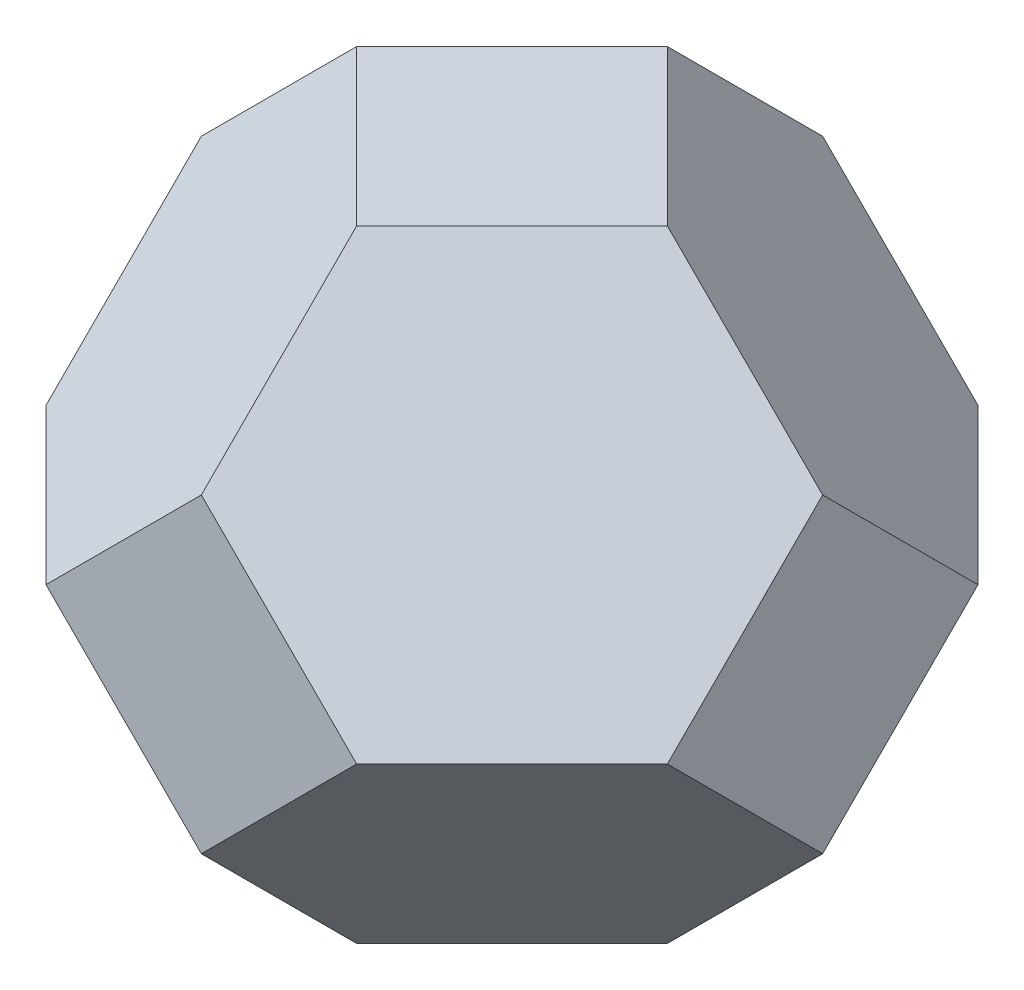
ISO-10303-21;
HEADER;
FILE_DESCRIPTION(('STEP AP214'),'2;1');
FILE_NAME('part.step','',(''),(''),'','','');
FILE_SCHEMA(('AUTOMOTIVE_DESIGN { 1 0 10303 214 1 1 1 1 }'));
ENDSEC;
DATA;
#1=APPLICATION_CONTEXT('core data for automotive mechanical design processes');
#2=APPLICATION_PROTOCOL_DEFINITION('international standard','automotive_design',2000,#1);
#3=PRODUCT_CONTEXT('',#1,'mechanical');
#4=PRODUCT('Part','Part','',(#3));
#5=PRODUCT_RELATED_PRODUCT_CATEGORY('part','',(#4));
#6=PRODUCT_DEFINITION_FORMATION('','',#4);
#7=PRODUCT_DEFINITION_CONTEXT('part definition',#1,'design');
#8=PRODUCT_DEFINITION('design','',#6,#7);
#9=PRODUCT_DEFINITION_SHAPE('','',#8);
#10=(LENGTH_UNIT() NAMED_UNIT(*) SI_UNIT(.MILLI.,.METRE.));
#11=(NAMED_UNIT(*) PLANE_ANGLE_UNIT() SI_UNIT($,.RADIAN.));
#12=(NAMED_UNIT(*) SI_UNIT($,.STERADIAN.) SOLID_ANGLE_UNIT());
#13=UNCERTAINTY_MEASURE_WITH_UNIT(LENGTH_MEASURE(1.E-05),#10,'distance_accuracy_value','');
#14=(GEOMETRIC_REPRESENTATION_CONTEXT(3) GLOBAL_UNCERTAINTY_ASSIGNED_CONTEXT((#13)) GLOBAL_UNIT_ASSIGNED_CONTEXT((#10,
#11,#12)) REPRESENTATION_CONTEXT('',''));
#15=CARTESIAN_POINT('',(0.,0.,0.));
#16=DIRECTION('',(0.,0.,1.));
#17=DIRECTION('',(1.,0.,0.));
#18=AXIS2_PLACEMENT_3D('',#15,#16,#17);
#19=CARTESIAN_POINT('',(0.,-23.57,0.));
#20=DIRECTION('',(0.,-1.,0.));
#21=DIRECTION('',(0.,0.,1.));
#22=AXIS2_PLACEMENT_3D('',#19,#20,#21);
#23=PLANE('',#22);
#24=DIRECTION('',(-0.707106781186549,0.,-0.707106781186546));
#25=VECTOR('',#24,1.);
#26=CARTESIAN_POINT('',(-11.7830847616923,-23.57,-23.5722542976351));
#27=LINE('',#26,#25);
#28=CARTESIAN_POINT('',(11.7891695359429,-23.57,0.));
#29=VERTEX_POINT('',#28);
#30=CARTESIAN_POINT('',(0.,-23.57,-11.7891695359429));
#31=VERTEX_POINT('',#30);
#32=EDGE_CURVE('E188',#29,#31,#27,.T.);
#33=ORIENTED_EDGE('',*,*,#32,.F.);
#34=DIRECTION('',(0.707106781186546,0.,-0.707106781186549));
#35=VECTOR('',#34,1.);
#36=CARTESIAN_POINT('',(-11.7830847616922,-23.57,23.5722542976352));
#37=LINE('',#36,#35);
#38=CARTESIAN_POINT('',(0.,-23.57,11.7891695359429));
#39=VERTEX_POINT('',#38);
#40=EDGE_CURVE('E165',#39,#29,#37,.T.);
#41=ORIENTED_EDGE('',*,*,#40,.F.);
#42=DIRECTION('',(0.707106781186549,0.,0.707106781186546));
#43=VECTOR('',#42,1.);
#44=CARTESIAN_POINT('',(-23.5722542976352,-23.57,-11.7830847616922));
#45=LINE('',#44,#43);
#46=CARTESIAN_POINT('',(-11.7891695359429,-23.57,0.));
#47=VERTEX_POINT('',#46);
#48=EDGE_CURVE('E180',#47,#39,#45,.T.);
#49=ORIENTED_EDGE('',*,*,#48,.F.);
#50=DIRECTION('',(-0.707106781186546,0.,0.707106781186549));
#51=VECTOR('',#50,1.);
#52=CARTESIAN_POINT('',(-23.5722542976351,-23.57,11.7830847616923));
#53=LINE('',#52,#51);
#54=EDGE_CURVE('E69',#31,#47,#53,.T.);
#55=ORIENTED_EDGE('',*,*,#54,.F.);
#56=EDGE_LOOP('',(#33,#41,#49,#55));
#57=FACE_BOUND('',#56,.T.);
#58=ADVANCED_FACE('F52',(#57),#23,.T.);
#59=CARTESIAN_POINT('',(0.,0.,-23.57));
#60=DIRECTION('',(0.,0.,-1.));
#61=DIRECTION('',(-1.,0.,0.));
#62=AXIS2_PLACEMENT_3D('',#59,#60,#61);
#63=PLANE('',#62);
#64=DIRECTION('',(0.707049316482423,0.707164241221047,0.));
#65=VECTOR('',#64,1.);
#66=CARTESIAN_POINT('',(5.89362725418458,-5.89266945183508,-23.57));
#67=LINE('',#66,#65);
#68=CARTESIAN_POINT('',(0.,-11.7872546640517,-23.57));
#69=VERTEX_POINT('',#68);
#70=CARTESIAN_POINT('',(11.7853390593273,0.,-23.57));
#71=VERTEX_POINT('',#70);
#72=EDGE_CURVE('E190',#69,#71,#67,.T.);
#73=ORIENTED_EDGE('',*,*,#72,.F.);
#74=DIRECTION('',(0.707049316482424,-0.707164241221046,0.));
#75=VECTOR('',#74,1.);
#76=CARTESIAN_POINT('',(-23.5684236653923,11.7849998443473,-23.5699999999999));
#77=LINE('',#76,#75);
#78=CARTESIAN_POINT('',(-11.7853390593274,0.,-23.57));
#79=VERTEX_POINT('',#78);
#80=EDGE_CURVE('E77',#79,#69,#77,.T.);
#81=ORIENTED_EDGE('',*,*,#80,.F.);
#82=DIRECTION('',(-0.707049316482424,-0.707164241221046,0.));
#83=VECTOR('',#82,1.);
#84=CARTESIAN_POINT('',(-23.5684236653923,-11.7849998443473,-23.5699999999999));
#85=LINE('',#84,#83);
#86=CARTESIAN_POINT('',(0.,11.7872546640517,-23.57));
#87=VERTEX_POINT('',#86);
#88=EDGE_CURVE('E203',#79,#87,#85,.F.);
#89=ORIENTED_EDGE('',*,*,#88,.T.);
#90=DIRECTION('',(-0.707049316482423,0.707164241221047,0.));
#91=VECTOR('',#90,1.);
#92=CARTESIAN_POINT('',(5.89362725418458,5.89266945183508,-23.57));
#93=LINE('',#92,#91);
#94=EDGE_CURVE('E208',#87,#71,#93,.F.);
#95=ORIENTED_EDGE('',*,*,#94,.T.);
#96=EDGE_LOOP('',(#73,#81,#89,#95));
#97=FACE_BOUND('',#96,.T.);
#98=ADVANCED_FACE('F257',(#97),#63,.T.);
#99=CARTESIAN_POINT('',(-23.57,0.,0.));
#100=DIRECTION('',(-1.,0.,0.));
#101=DIRECTION('',(0.,0.,1.));
#102=AXIS2_PLACEMENT_3D('',#99,#100,#101);
#103=PLANE('',#102);
#104=DIRECTION('',(0.,-0.707164241221047,-0.707049316482423));
#105=VECTOR('',#104,1.);
#106=CARTESIAN_POINT('',(-23.57,-5.89266945183509,5.89362725418467));
#107=LINE('',#106,#105);
#108=CARTESIAN_POINT('',(-23.57,0.,11.7853390593274));
#109=VERTEX_POINT('',#108);
#110=CARTESIAN_POINT('',(-23.57,-11.7872546640517,0.));
#111=VERTEX_POINT('',#110);
#112=EDGE_CURVE('E181',#109,#111,#107,.T.);
#113=ORIENTED_EDGE('',*,*,#112,.F.);
#114=DIRECTION('',(0.,-0.707164241221047,0.707049316482423));
#115=VECTOR('',#114,1.);
#116=CARTESIAN_POINT('',(-23.57,5.89266945183509,5.89362725418467));
#117=LINE('',#116,#115);
#118=CARTESIAN_POINT('',(-23.57,11.7872546640517,0.));
#119=VERTEX_POINT('',#118);
#120=EDGE_CURVE('E177',#109,#119,#117,.F.);
#121=ORIENTED_EDGE('',*,*,#120,.T.);
#122=DIRECTION('',(0.,0.707164241221046,0.707049316482424));
#123=VECTOR('',#122,1.);
#124=CARTESIAN_POINT('',(-23.57,5.89266945183513,-5.89362725418456));
#125=LINE('',#124,#123);
#126=CARTESIAN_POINT('',(-23.57,0.,-11.7853390593274));
#127=VERTEX_POINT('',#126);
#128=EDGE_CURVE('E207',#119,#127,#125,.F.);
#129=ORIENTED_EDGE('',*,*,#128,.T.);
#130=DIRECTION('',(0.,0.707164241221046,-0.707049316482424));
#131=VECTOR('',#130,1.);
#132=CARTESIAN_POINT('',(-23.57,-5.89266945183513,-5.89362725418456));
#133=LINE('',#132,#131);
#134=EDGE_CURVE('E194',#111,#127,#133,.T.);
#135=ORIENTED_EDGE('',*,*,#134,.F.);
#136=EDGE_LOOP('',(#113,#121,#129,#135));
#137=FACE_BOUND('',#136,.T.);
#138=ADVANCED_FACE('F250',(#137),#103,.T.);
#139=CARTESIAN_POINT('',(0.,23.57,0.));
#140=DIRECTION('',(0.,1.,0.));
#141=DIRECTION('',(0.,0.,1.));
#142=AXIS2_PLACEMENT_3D('',#139,#140,#141);
#143=PLANE('',#142);
#144=DIRECTION('',(-0.707106781186546,0.,0.707106781186549));
#145=VECTOR('',#144,1.);
#146=CARTESIAN_POINT('',(-11.7830847616922,23.57,23.5722542976352));
#147=LINE('',#146,#145);
#148=CARTESIAN_POINT('',(0.,23.57,11.7891695359429));
#149=VERTEX_POINT('',#148);
#150=CARTESIAN_POINT('',(11.7891695359429,23.57,0.));
#151=VERTEX_POINT('',#150);
#152=EDGE_CURVE('E171',#149,#151,#147,.F.);
#153=ORIENTED_EDGE('',*,*,#152,.T.);
#154=DIRECTION('',(0.707106781186549,0.,0.707106781186546));
#155=VECTOR('',#154,1.);
#156=CARTESIAN_POINT('',(-11.7830847616923,23.57,-23.5722542976351));
#157=LINE('',#156,#155);
#158=CARTESIAN_POINT('',(0.,23.57,-11.7891695359429));
#159=VERTEX_POINT('',#158);
#160=EDGE_CURVE('E219',#151,#159,#157,.F.);
#161=ORIENTED_EDGE('',*,*,#160,.T.);
#162=DIRECTION('',(0.707106781186546,0.,-0.707106781186549));
#163=VECTOR('',#162,1.);
#164=CARTESIAN_POINT('',(-23.5722542976351,23.57,11.7830847616923));
#165=LINE('',#164,#163);
#166=CARTESIAN_POINT('',(-11.7891695359429,23.57,0.));
#167=VERTEX_POINT('',#166);
#168=EDGE_CURVE('E206',#159,#167,#165,.F.);
#169=ORIENTED_EDGE('',*,*,#168,.T.);
#170=DIRECTION('',(-0.707106781186549,0.,-0.707106781186546));
#171=VECTOR('',#170,1.);
#172=CARTESIAN_POINT('',(-23.5722542976352,23.57,-11.7830847616922));
#173=LINE('',#172,#171);
#174=EDGE_CURVE('E233',#167,#149,#173,.F.);
#175=ORIENTED_EDGE('',*,*,#174,.T.);
#176=EDGE_LOOP('',(#153,#161,#169,#175));
#177=FACE_BOUND('',#176,.T.);
#178=ADVANCED_FACE('F265',(#177),#143,.T.);
#179=CARTESIAN_POINT('',(23.57,0.,0.));
#180=DIRECTION('',(1.,0.,0.));
#181=DIRECTION('',(0.,0.,-1.));
#182=AXIS2_PLACEMENT_3D('',#179,#180,#181);
#183=PLANE('',#182);
#184=DIRECTION('',(0.,-0.707164241221047,0.707049316482423));
#185=VECTOR('',#184,1.);
#186=CARTESIAN_POINT('',(23.57,11.7849998443473,-23.5684236653922));
#187=LINE('',#186,#185);
#188=CARTESIAN_POINT('',(23.57,0.,-11.7853390593274));
#189=VERTEX_POINT('',#188);
#190=CARTESIAN_POINT('',(23.57,-11.7872546640517,0.));
#191=VERTEX_POINT('',#190);
#192=EDGE_CURVE('E214',#189,#191,#187,.T.);
#193=ORIENTED_EDGE('',*,*,#192,.F.);
#194=DIRECTION('',(0.,-0.707164241221047,-0.707049316482423));
#195=VECTOR('',#194,1.);
#196=CARTESIAN_POINT('',(23.57,-11.7849998443473,-23.5684236653922));
#197=LINE('',#196,#195);
#198=CARTESIAN_POINT('',(23.57,11.7872546640517,0.));
#199=VERTEX_POINT('',#198);
#200=EDGE_CURVE('E211',#189,#199,#197,.F.);
#201=ORIENTED_EDGE('',*,*,#200,.T.);
#202=DIRECTION('',(0.,0.707164241221046,-0.707049316482424));
#203=VECTOR('',#202,1.);
#204=CARTESIAN_POINT('',(23.57,-11.7849998443473,23.5684236653922));
#205=LINE('',#204,#203);
#206=CARTESIAN_POINT('',(23.57,0.,11.7853390593274));
#207=VERTEX_POINT('',#206);
#208=EDGE_CURVE('E169',#199,#207,#205,.F.);
#209=ORIENTED_EDGE('',*,*,#208,.T.);
#210=DIRECTION('',(0.,0.707164241221046,0.707049316482424));
#211=VECTOR('',#210,1.);
#212=CARTESIAN_POINT('',(23.57,11.7849998443473,23.5684236653922));
#213=LINE('',#212,#211);
#214=EDGE_CURVE('E56',#191,#207,#213,.T.);
#215=ORIENTED_EDGE('',*,*,#214,.F.);
#216=EDGE_LOOP('',(#193,#201,#209,#215));
#217=FACE_BOUND('',#216,.T.);
#218=ADVANCED_FACE('F270',(#217),#183,.T.);
#219=CARTESIAN_POINT('',(2.46882645469598E-13,0.,23.57));
#220=DIRECTION('',(0.,0.,1.));
#221=DIRECTION('',(1.,0.,0.));
#222=AXIS2_PLACEMENT_3D('',#219,#220,#221);
#223=PLANE('',#222);
#224=DIRECTION('',(-0.707049316482426,-0.707164241221043,0.));
#225=VECTOR('',#224,1.);
#226=CARTESIAN_POINT('',(5.8936272541846,-5.89266945183521,23.5699999999999));
#227=LINE('',#226,#225);
#228=CARTESIAN_POINT('',(11.7853390593275,0.,23.5699999999999));
#229=VERTEX_POINT('',#228);
#230=CARTESIAN_POINT('',(0.,-11.7872546640517,23.57));
#231=VERTEX_POINT('',#230);
#232=EDGE_CURVE('E149',#229,#231,#227,.T.);
#233=ORIENTED_EDGE('',*,*,#232,.F.);
#234=DIRECTION('',(0.707049316482426,-0.707164241221043,0.));
#235=VECTOR('',#234,1.);
#236=CARTESIAN_POINT('',(5.8936272541846,5.89266945183521,23.5699999999999));
#237=LINE('',#236,#235);
#238=CARTESIAN_POINT('',(0.,11.7872546640517,23.57));
#239=VERTEX_POINT('',#238);
#240=EDGE_CURVE('E162',#229,#239,#237,.F.);
#241=ORIENTED_EDGE('',*,*,#240,.T.);
#242=DIRECTION('',(0.70704931648242,0.707164241221049,0.));
#243=VECTOR('',#242,1.);
#244=CARTESIAN_POINT('',(-23.5684236653919,-11.7849998443473,23.5700000000002));
#245=LINE('',#244,#243);
#246=CARTESIAN_POINT('',(-11.7853390593272,0.,23.5700000000001));
#247=VERTEX_POINT('',#246);
#248=EDGE_CURVE('E176',#239,#247,#245,.F.);
#249=ORIENTED_EDGE('',*,*,#248,.T.);
#250=DIRECTION('',(-0.70704931648242,0.707164241221049,0.));
#251=VECTOR('',#250,1.);
#252=CARTESIAN_POINT('',(-23.5684236653919,11.7849998443473,23.5700000000002));
#253=LINE('',#252,#251);
#254=EDGE_CURVE('E164',#231,#247,#253,.T.);
#255=ORIENTED_EDGE('',*,*,#254,.F.);
#256=EDGE_LOOP('',(#233,#241,#249,#255));
#257=FACE_BOUND('',#256,.T.);
#258=ADVANCED_FACE('F160',(#257),#223,.T.);
#259=CARTESIAN_POINT('',(0.,0.,-35.3553390593274));
#260=DIRECTION('',(0.577381545199979,-0.577287712085549,-0.577381545199981));
#261=DIRECTION('',(0.408204055911358,0.816540811885745,-0.40820405591136));
#262=AXIS2_PLACEMENT_3D('',#259,#260,#261);
#263=PLANE('',#262);
#264=DIRECTION('',(-0.707106781186549,0.,-0.707106781186546));
#265=VECTOR('',#264,1.);
#266=CARTESIAN_POINT('',(0.,0.,-35.3553390593274));
#267=LINE('',#266,#265);
#268=EDGE_CURVE('E198',#189,#71,#267,.T.);
#269=ORIENTED_EDGE('',*,*,#268,.F.);
#270=ORIENTED_EDGE('',*,*,#192,.T.);
#271=DIRECTION('',(0.707049316482423,0.707164241221046,0.));
#272=VECTOR('',#271,1.);
#273=CARTESIAN_POINT('',(17.6805426481198,-17.6776692961824,0.));
#274=LINE('',#273,#272);
#275=EDGE_CURVE('E187',#29,#191,#274,.T.);
#276=ORIENTED_EDGE('',*,*,#275,.F.);
#277=ORIENTED_EDGE('',*,*,#32,.T.);
#278=DIRECTION('',(0.,0.707164241221046,-0.707049316482423));
#279=VECTOR('',#278,1.);
#280=CARTESIAN_POINT('',(0.,0.,-35.3553390593274));
#281=LINE('',#280,#279);
#282=EDGE_CURVE('E156',#31,#69,#281,.T.);
#283=ORIENTED_EDGE('',*,*,#282,.T.);
#284=ORIENTED_EDGE('',*,*,#72,.T.);
#285=EDGE_LOOP('',(#269,#270,#276,#277,#283,#284));
#286=FACE_BOUND('',#285,.T.);
#287=ADVANCED_FACE('F258',(#286),#263,.T.);
#288=CARTESIAN_POINT('',(-35.3553390593274,0.,0.));
#289=DIRECTION('',(-0.577381545199981,-0.577287712085549,-0.577381545199979));
#290=DIRECTION('',(-0.40820405591136,0.816540811885745,-0.408204055911358));
#291=AXIS2_PLACEMENT_3D('',#288,#289,#290);
#292=PLANE('',#291);
#293=DIRECTION('',(-0.707106781186546,0.,0.707106781186549));
#294=VECTOR('',#293,1.);
#295=CARTESIAN_POINT('',(-35.3553390593274,0.,0.));
#296=LINE('',#295,#294);
#297=EDGE_CURVE('E199',#79,#127,#296,.T.);
#298=ORIENTED_EDGE('',*,*,#297,.F.);
#299=ORIENTED_EDGE('',*,*,#80,.T.);
#300=ORIENTED_EDGE('',*,*,#282,.F.);
#301=ORIENTED_EDGE('',*,*,#54,.T.);
#302=DIRECTION('',(-0.707049316482423,0.707164241221046,0.));
#303=VECTOR('',#302,1.);
#304=CARTESIAN_POINT('',(-35.3553390593274,0.,0.));
#305=LINE('',#304,#303);
#306=EDGE_CURVE('E182',#47,#111,#305,.T.);
#307=ORIENTED_EDGE('',*,*,#306,.T.);
#308=ORIENTED_EDGE('',*,*,#134,.T.);
#309=EDGE_LOOP('',(#298,#299,#300,#301,#307,#308));
#310=FACE_BOUND('',#309,.T.);
#311=ADVANCED_FACE('F245',(#310),#292,.T.);
#312=CARTESIAN_POINT('',(-35.3553390593274,0.,0.));
#313=DIRECTION('',(-0.577381545199979,-0.577287712085549,0.577381545199981));
#314=DIRECTION('',(0.408204055911358,-0.816540811885745,-0.40820405591136));
#315=AXIS2_PLACEMENT_3D('',#312,#313,#314);
#316=PLANE('',#315);
#317=DIRECTION('',(0.707106781186549,0.,0.707106781186546));
#318=VECTOR('',#317,1.);
#319=CARTESIAN_POINT('',(-35.3553390593274,0.,0.));
#320=LINE('',#319,#318);
#321=EDGE_CURVE('E155',#109,#247,#320,.T.);
#322=ORIENTED_EDGE('',*,*,#321,.F.);
#323=ORIENTED_EDGE('',*,*,#112,.T.);
#324=ORIENTED_EDGE('',*,*,#306,.F.);
#325=ORIENTED_EDGE('',*,*,#48,.T.);
#326=DIRECTION('',(0.,0.707164241221046,0.707049316482423));
#327=VECTOR('',#326,1.);
#328=CARTESIAN_POINT('',(0.,-17.6776692961824,17.6805426481198));
#329=LINE('',#328,#327);
#330=EDGE_CURVE('E185',#39,#231,#329,.T.);
#331=ORIENTED_EDGE('',*,*,#330,.T.);
#332=ORIENTED_EDGE('',*,*,#254,.T.);
#333=EDGE_LOOP('',(#322,#323,#324,#325,#331,#332));
#334=FACE_BOUND('',#333,.T.);
#335=ADVANCED_FACE('F261',(#334),#316,.T.);
#336=CARTESIAN_POINT('',(-35.3553390593274,0.,0.));
#337=DIRECTION('',(-0.577381545199981,0.577287712085549,-0.577381545199979));
#338=DIRECTION('',(0.40820405591136,0.816540811885745,0.408204055911358));
#339=AXIS2_PLACEMENT_3D('',#336,#337,#338);
#340=PLANE('',#339);
#341=ORIENTED_EDGE('',*,*,#168,.F.);
#342=DIRECTION('',(0.,-0.707164241221046,-0.707049316482423));
#343=VECTOR('',#342,1.);
#344=CARTESIAN_POINT('',(0.,17.6776692961824,-17.6805426481198));
#345=LINE('',#344,#343);
#346=EDGE_CURVE('E195',#159,#87,#345,.T.);
#347=ORIENTED_EDGE('',*,*,#346,.T.);
#348=ORIENTED_EDGE('',*,*,#88,.F.);
#349=ORIENTED_EDGE('',*,*,#297,.T.);
#350=ORIENTED_EDGE('',*,*,#128,.F.);
#351=DIRECTION('',(-0.707049316482423,-0.707164241221046,0.));
#352=VECTOR('',#351,1.);
#353=CARTESIAN_POINT('',(-35.3553390593274,0.,0.));
#354=LINE('',#353,#352);
#355=EDGE_CURVE('E197',#167,#119,#354,.T.);
#356=ORIENTED_EDGE('',*,*,#355,.F.);
#357=EDGE_LOOP('',(#341,#347,#348,#349,#350,#356));
#358=FACE_BOUND('',#357,.T.);
#359=ADVANCED_FACE('F253',(#358),#340,.T.);
#360=CARTESIAN_POINT('',(0.,0.,-35.3553390593274));
#361=DIRECTION('',(0.577381545199979,0.577287712085549,-0.577381545199981));
#362=DIRECTION('',(-0.408204055911358,0.816540811885745,0.40820405591136));
#363=AXIS2_PLACEMENT_3D('',#360,#361,#362);
#364=PLANE('',#363);
#365=ORIENTED_EDGE('',*,*,#160,.F.);
#366=DIRECTION('',(0.707049316482423,-0.707164241221046,0.));
#367=VECTOR('',#366,1.);
#368=CARTESIAN_POINT('',(17.6805426481198,17.6776692961824,0.));
#369=LINE('',#368,#367);
#370=EDGE_CURVE('E12',#151,#199,#369,.T.);
#371=ORIENTED_EDGE('',*,*,#370,.T.);
#372=ORIENTED_EDGE('',*,*,#200,.F.);
#373=ORIENTED_EDGE('',*,*,#268,.T.);
#374=ORIENTED_EDGE('',*,*,#94,.F.);
#375=ORIENTED_EDGE('',*,*,#346,.F.);
#376=EDGE_LOOP('',(#365,#371,#372,#373,#374,#375));
#377=FACE_BOUND('',#376,.T.);
#378=ADVANCED_FACE('F268',(#377),#364,.T.);
#379=CARTESIAN_POINT('',(0.,0.,35.3553390593274));
#380=DIRECTION('',(0.577381545199981,-0.577287712085549,0.577381545199979));
#381=DIRECTION('',(-0.40820405591136,-0.816540811885745,-0.408204055911358));
#382=AXIS2_PLACEMENT_3D('',#379,#380,#381);
#383=PLANE('',#382);
#384=ORIENTED_EDGE('',*,*,#275,.T.);
#385=ORIENTED_EDGE('',*,*,#214,.T.);
#386=DIRECTION('',(0.707106781186546,0.,-0.707106781186549));
#387=VECTOR('',#386,1.);
#388=CARTESIAN_POINT('',(0.,0.,35.3553390593274));
#389=LINE('',#388,#387);
#390=EDGE_CURVE('E144',#229,#207,#389,.T.);
#391=ORIENTED_EDGE('',*,*,#390,.F.);
#392=ORIENTED_EDGE('',*,*,#232,.T.);
#393=ORIENTED_EDGE('',*,*,#330,.F.);
#394=ORIENTED_EDGE('',*,*,#40,.T.);
#395=EDGE_LOOP('',(#384,#385,#391,#392,#393,#394));
#396=FACE_BOUND('',#395,.T.);
#397=ADVANCED_FACE('F147',(#396),#383,.T.);
#398=CARTESIAN_POINT('',(-35.3553390593274,0.,0.));
#399=DIRECTION('',(-0.577381545199979,0.577287712085549,0.577381545199981));
#400=DIRECTION('',(-0.408204055911358,-0.816540811885745,0.40820405591136));
#401=AXIS2_PLACEMENT_3D('',#398,#399,#400);
#402=PLANE('',#401);
#403=ORIENTED_EDGE('',*,*,#174,.F.);
#404=ORIENTED_EDGE('',*,*,#355,.T.);
#405=ORIENTED_EDGE('',*,*,#120,.F.);
#406=ORIENTED_EDGE('',*,*,#321,.T.);
#407=ORIENTED_EDGE('',*,*,#248,.F.);
#408=DIRECTION('',(0.,-0.707164241221046,0.707049316482423));
#409=VECTOR('',#408,1.);
#410=CARTESIAN_POINT('',(0.,0.,35.3553390593274));
#411=LINE('',#410,#409);
#412=EDGE_CURVE('E61',#149,#239,#411,.T.);
#413=ORIENTED_EDGE('',*,*,#412,.F.);
#414=EDGE_LOOP('',(#403,#404,#405,#406,#407,#413));
#415=FACE_BOUND('',#414,.T.);
#416=ADVANCED_FACE('F264',(#415),#402,.T.);
#417=CARTESIAN_POINT('',(0.,0.,35.3553390593274));
#418=DIRECTION('',(0.577381545199981,0.577287712085549,0.577381545199979));
#419=DIRECTION('',(0.40820405591136,-0.816540811885745,0.408204055911358));
#420=AXIS2_PLACEMENT_3D('',#417,#418,#419);
#421=PLANE('',#420);
#422=ORIENTED_EDGE('',*,*,#152,.F.);
#423=ORIENTED_EDGE('',*,*,#412,.T.);
#424=ORIENTED_EDGE('',*,*,#240,.F.);
#425=ORIENTED_EDGE('',*,*,#390,.T.);
#426=ORIENTED_EDGE('',*,*,#208,.F.);
#427=ORIENTED_EDGE('',*,*,#370,.F.);
#428=EDGE_LOOP('',(#422,#423,#424,#425,#426,#427));
#429=FACE_BOUND('',#428,.T.);
#430=ADVANCED_FACE('F54',(#429),#421,.T.);
#431=CLOSED_SHELL('',(#58,#98,#138,#178,#218,#258,#287,#311,#335,#359,#378,#397,#416,#430));
#432=MANIFOLD_SOLID_BREP('B2',#431);
#433=ADVANCED_BREP_SHAPE_REPRESENTATION('',(#18,#432),#14);
#434=SHAPE_DEFINITION_REPRESENTATION(#9,#433);
ENDSEC;
END-ISO-10303-21;
